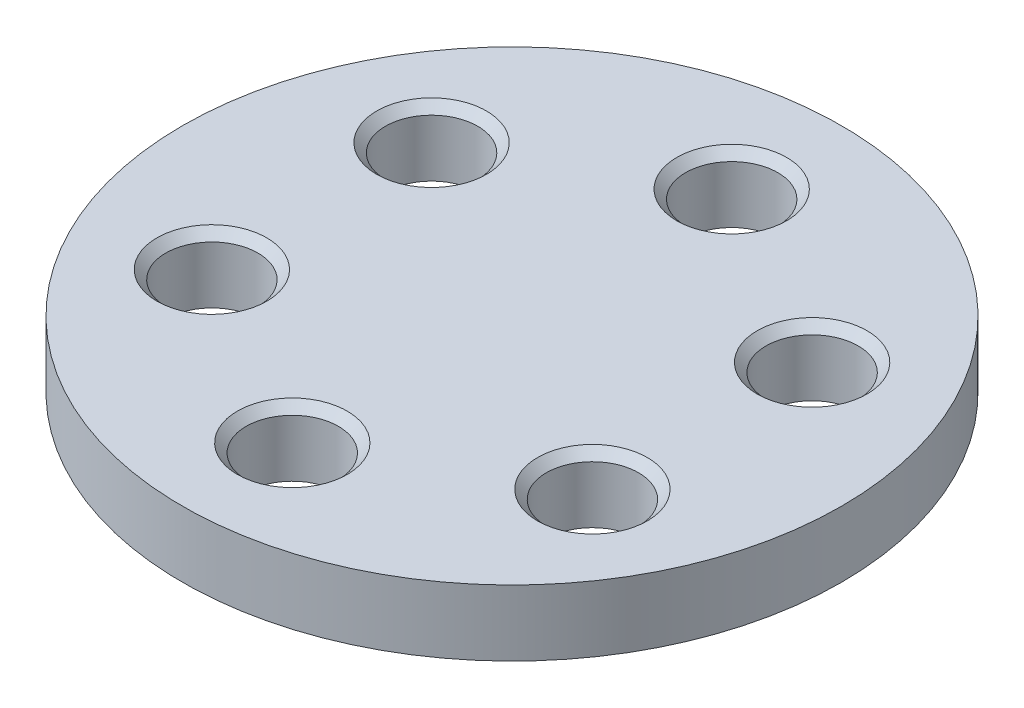
ISO-10303-21;
HEADER;
FILE_DESCRIPTION(('STEP AP214'),'2;1');
FILE_NAME('part.step','',(''),(''),'','','');
FILE_SCHEMA(('AUTOMOTIVE_DESIGN { 1 0 10303 214 1 1 1 1 }'));
ENDSEC;
DATA;
#1=APPLICATION_CONTEXT('core data for automotive mechanical design processes');
#2=APPLICATION_PROTOCOL_DEFINITION('international standard','automotive_design',2000,#1);
#3=PRODUCT_CONTEXT('',#1,'mechanical');
#4=PRODUCT('Part','Part','',(#3));
#5=PRODUCT_RELATED_PRODUCT_CATEGORY('part','',(#4));
#6=PRODUCT_DEFINITION_FORMATION('','',#4);
#7=PRODUCT_DEFINITION_CONTEXT('part definition',#1,'design');
#8=PRODUCT_DEFINITION('design','',#6,#7);
#9=PRODUCT_DEFINITION_SHAPE('','',#8);
#10=(LENGTH_UNIT() NAMED_UNIT(*) SI_UNIT(.MILLI.,.METRE.));
#11=(NAMED_UNIT(*) PLANE_ANGLE_UNIT() SI_UNIT($,.RADIAN.));
#12=(NAMED_UNIT(*) SI_UNIT($,.STERADIAN.) SOLID_ANGLE_UNIT());
#13=UNCERTAINTY_MEASURE_WITH_UNIT(LENGTH_MEASURE(1.E-05),#10,'distance_accuracy_value','');
#14=(GEOMETRIC_REPRESENTATION_CONTEXT(3) GLOBAL_UNCERTAINTY_ASSIGNED_CONTEXT((#13)) GLOBAL_UNIT_ASSIGNED_CONTEXT((#10,
#11,#12)) REPRESENTATION_CONTEXT('',''));
#15=CARTESIAN_POINT('',(0.,0.,0.));
#16=DIRECTION('',(0.,0.,1.));
#17=DIRECTION('',(1.,0.,0.));
#18=AXIS2_PLACEMENT_3D('',#15,#16,#17);
#19=CARTESIAN_POINT('',(-1.26546179408335E-13,43.9999999999999,0.));
#20=DIRECTION('',(0.,1.,0.));
#21=DIRECTION('',(-0.998143310073028,0.,-0.0609092156940087));
#22=AXIS2_PLACEMENT_3D('',#19,#20,#21);
#23=PLANE('',#22);
#24=CARTESIAN_POINT('',(-1.46592133389029E-13,43.9999999999999,-10.));
#25=DIRECTION('',(0.,1.,0.));
#26=DIRECTION('',(0.,0.,1.));
#27=AXIS2_PLACEMENT_3D('',#24,#25,#26);
#28=CIRCLE('',#27,2.5);
#29=CARTESIAN_POINT('',(-1.46592133389029E-13,43.9999999999999,-7.5));
#30=VERTEX_POINT('',#29);
#31=EDGE_CURVE('E101',#30,#30,#28,.T.);
#32=ORIENTED_EDGE('',*,*,#31,.F.);
#33=EDGE_LOOP('',(#32));
#34=FACE_BOUND('',#33,.T.);
#35=CARTESIAN_POINT('',(8.66025403784424,44.,-5.));
#36=DIRECTION('',(0.,1.,0.));
#37=DIRECTION('',(0.,0.,1.));
#38=AXIS2_PLACEMENT_3D('',#35,#36,#37);
#39=CIRCLE('',#38,2.5);
#40=CARTESIAN_POINT('',(8.66025403784424,44.,-2.5));
#41=VERTEX_POINT('',#40);
#42=EDGE_CURVE('E92',#41,#41,#39,.T.);
#43=ORIENTED_EDGE('',*,*,#42,.F.);
#44=EDGE_LOOP('',(#43));
#45=FACE_BOUND('',#44,.T.);
#46=CARTESIAN_POINT('',(8.66025403784424,44.,5.));
#47=DIRECTION('',(0.,1.,0.));
#48=DIRECTION('',(0.,0.,1.));
#49=AXIS2_PLACEMENT_3D('',#46,#47,#48);
#50=CIRCLE('',#49,2.5);
#51=CARTESIAN_POINT('',(8.66025403784424,44.,7.5));
#52=VERTEX_POINT('',#51);
#53=EDGE_CURVE('E83',#52,#52,#50,.T.);
#54=ORIENTED_EDGE('',*,*,#53,.F.);
#55=EDGE_LOOP('',(#54));
#56=FACE_BOUND('',#55,.T.);
#57=CARTESIAN_POINT('',(-1.44437402907189E-13,43.9999999999999,10.));
#58=DIRECTION('',(0.,1.,0.));
#59=DIRECTION('',(0.,0.,1.));
#60=AXIS2_PLACEMENT_3D('',#57,#58,#59);
#61=CIRCLE('',#60,2.5);
#62=CARTESIAN_POINT('',(-1.44437402907189E-13,43.9999999999999,12.5));
#63=VERTEX_POINT('',#62);
#64=EDGE_CURVE('E74',#63,#63,#61,.T.);
#65=ORIENTED_EDGE('',*,*,#64,.F.);
#66=EDGE_LOOP('',(#65));
#67=FACE_BOUND('',#66,.T.);
#68=CARTESIAN_POINT('',(-8.66025403784453,43.9999999999999,5.00000000000001));
#69=DIRECTION('',(0.,1.,0.));
#70=DIRECTION('',(0.,0.,1.));
#71=AXIS2_PLACEMENT_3D('',#68,#69,#70);
#72=CIRCLE('',#71,2.5);
#73=CARTESIAN_POINT('',(-8.66025403784453,43.9999999999999,7.50000000000001));
#74=VERTEX_POINT('',#73);
#75=EDGE_CURVE('E65',#74,#74,#72,.T.);
#76=ORIENTED_EDGE('',*,*,#75,.F.);
#77=EDGE_LOOP('',(#76));
#78=FACE_BOUND('',#77,.T.);
#79=CARTESIAN_POINT('',(-8.66025403784453,43.9999999999999,-5.));
#80=DIRECTION('',(0.,1.,0.));
#81=DIRECTION('',(0.,0.,1.));
#82=AXIS2_PLACEMENT_3D('',#79,#80,#81);
#83=CIRCLE('',#82,2.5);
#84=CARTESIAN_POINT('',(-8.66025403784453,43.9999999999999,-2.5));
#85=VERTEX_POINT('',#84);
#86=EDGE_CURVE('E56',#85,#85,#83,.T.);
#87=ORIENTED_EDGE('',*,*,#86,.F.);
#88=EDGE_LOOP('',(#87));
#89=FACE_BOUND('',#88,.T.);
#90=CARTESIAN_POINT('',(-1.46887962200071E-13,43.9999999999999,0.));
#91=DIRECTION('',(0.,1.,0.));
#92=DIRECTION('',(-1.,0.,0.));
#93=AXIS2_PLACEMENT_3D('',#90,#91,#92);
#94=CIRCLE('',#93,15.);
#95=CARTESIAN_POINT('',(-15.0000000000001,43.9999999999999,0.));
#96=VERTEX_POINT('',#95);
#97=EDGE_CURVE('E10',#96,#96,#94,.F.);
#98=ORIENTED_EDGE('',*,*,#97,.F.);
#99=EDGE_LOOP('',(#98));
#100=FACE_BOUND('',#99,.T.);
#101=ADVANCED_FACE('F37',(#34,#45,#56,#67,#78,#89,#100),#23,.T.);
#102=CARTESIAN_POINT('',(-1.36597215203414E-13,40.9999999999999,0.));
#103=DIRECTION('',(0.,-1.,0.));
#104=DIRECTION('',(1.,0.,0.));
#105=AXIS2_PLACEMENT_3D('',#102,#103,#104);
#106=PLANE('',#105);
#107=CARTESIAN_POINT('',(-1.46592133389029E-13,40.9999999999999,-10.));
#108=DIRECTION('',(0.,1.,0.));
#109=DIRECTION('',(0.,0.,1.));
#110=AXIS2_PLACEMENT_3D('',#107,#108,#109);
#111=CIRCLE('',#110,2.1);
#112=CARTESIAN_POINT('',(-1.46592133389029E-13,40.9999999999999,-7.9));
#113=VERTEX_POINT('',#112);
#114=EDGE_CURVE('E95',#113,#113,#111,.T.);
#115=ORIENTED_EDGE('',*,*,#114,.T.);
#116=EDGE_LOOP('',(#115));
#117=FACE_BOUND('',#116,.T.);
#118=CARTESIAN_POINT('',(8.66025403784424,41.,-5.));
#119=DIRECTION('',(0.,1.,0.));
#120=DIRECTION('',(0.,0.,1.));
#121=AXIS2_PLACEMENT_3D('',#118,#119,#120);
#122=CIRCLE('',#121,2.1);
#123=CARTESIAN_POINT('',(8.66025403784424,41.,-2.9));
#124=VERTEX_POINT('',#123);
#125=EDGE_CURVE('E86',#124,#124,#122,.T.);
#126=ORIENTED_EDGE('',*,*,#125,.T.);
#127=EDGE_LOOP('',(#126));
#128=FACE_BOUND('',#127,.T.);
#129=CARTESIAN_POINT('',(8.66025403784424,41.,5.));
#130=DIRECTION('',(0.,1.,0.));
#131=DIRECTION('',(0.,0.,1.));
#132=AXIS2_PLACEMENT_3D('',#129,#130,#131);
#133=CIRCLE('',#132,2.1);
#134=CARTESIAN_POINT('',(8.66025403784424,41.,7.1));
#135=VERTEX_POINT('',#134);
#136=EDGE_CURVE('E77',#135,#135,#133,.T.);
#137=ORIENTED_EDGE('',*,*,#136,.T.);
#138=EDGE_LOOP('',(#137));
#139=FACE_BOUND('',#138,.T.);
#140=CARTESIAN_POINT('',(-1.44437402907189E-13,40.9999999999999,10.));
#141=DIRECTION('',(0.,1.,0.));
#142=DIRECTION('',(0.,0.,1.));
#143=AXIS2_PLACEMENT_3D('',#140,#141,#142);
#144=CIRCLE('',#143,2.1);
#145=CARTESIAN_POINT('',(-1.44437402907189E-13,40.9999999999999,12.1));
#146=VERTEX_POINT('',#145);
#147=EDGE_CURVE('E68',#146,#146,#144,.T.);
#148=ORIENTED_EDGE('',*,*,#147,.T.);
#149=EDGE_LOOP('',(#148));
#150=FACE_BOUND('',#149,.T.);
#151=CARTESIAN_POINT('',(-8.66025403784453,40.9999999999999,5.00000000000001));
#152=DIRECTION('',(0.,1.,0.));
#153=DIRECTION('',(0.,0.,1.));
#154=AXIS2_PLACEMENT_3D('',#151,#152,#153);
#155=CIRCLE('',#154,2.1);
#156=CARTESIAN_POINT('',(-8.66025403784453,40.9999999999999,7.1));
#157=VERTEX_POINT('',#156);
#158=EDGE_CURVE('E59',#157,#157,#155,.T.);
#159=ORIENTED_EDGE('',*,*,#158,.T.);
#160=EDGE_LOOP('',(#159));
#161=FACE_BOUND('',#160,.T.);
#162=CARTESIAN_POINT('',(-8.66025403784453,40.9999999999999,-5.));
#163=DIRECTION('',(0.,1.,0.));
#164=DIRECTION('',(0.,0.,1.));
#165=AXIS2_PLACEMENT_3D('',#162,#163,#164);
#166=CIRCLE('',#165,2.1);
#167=CARTESIAN_POINT('',(-8.66025403784453,40.9999999999999,-2.9));
#168=VERTEX_POINT('',#167);
#169=EDGE_CURVE('E47',#168,#168,#166,.T.);
#170=ORIENTED_EDGE('',*,*,#169,.T.);
#171=EDGE_LOOP('',(#170));
#172=FACE_BOUND('',#171,.T.);
#173=CARTESIAN_POINT('',(-1.36597215203414E-13,40.9999999999999,0.));
#174=DIRECTION('',(0.,-1.,0.));
#175=DIRECTION('',(1.,0.,0.));
#176=AXIS2_PLACEMENT_3D('',#173,#174,#175);
#177=CIRCLE('',#176,15.);
#178=CARTESIAN_POINT('',(14.9999999999999,41.,0.));
#179=VERTEX_POINT('',#178);
#180=EDGE_CURVE('E43',#179,#179,#177,.T.);
#181=ORIENTED_EDGE('',*,*,#180,.T.);
#182=EDGE_LOOP('',(#181));
#183=FACE_BOUND('',#182,.T.);
#184=ADVANCED_FACE('F109',(#117,#128,#139,#150,#161,#172,#183),#106,.T.);
#185=CARTESIAN_POINT('',(-2.924211018963E-13,86.4264068711927,0.));
#186=DIRECTION('',(0.,-1.,0.));
#187=DIRECTION('',(1.,0.,0.));
#188=AXIS2_PLACEMENT_3D('',#185,#186,#187);
#189=CYLINDRICAL_SURFACE('',#188,15.);
#190=ORIENTED_EDGE('',*,*,#180,.F.);
#191=EDGE_LOOP('',(#190));
#192=FACE_BOUND('',#191,.T.);
#193=ORIENTED_EDGE('',*,*,#97,.T.);
#194=EDGE_LOOP('',(#193));
#195=FACE_BOUND('',#194,.T.);
#196=ADVANCED_FACE('F134',(#192,#195),#189,.T.);
#197=CARTESIAN_POINT('',(-8.66025403784453,43.9999999999999,-5.));
#198=DIRECTION('',(0.,1.,0.));
#199=DIRECTION('',(0.,0.,1.));
#200=AXIS2_PLACEMENT_3D('',#197,#198,#199);
#201=CYLINDRICAL_SURFACE('',#200,2.09999999999999);
#202=ORIENTED_EDGE('',*,*,#169,.F.);
#203=EDGE_LOOP('',(#202));
#204=FACE_BOUND('',#203,.T.);
#205=CARTESIAN_POINT('',(-8.66025403784453,43.5999999999999,-5.));
#206=DIRECTION('',(0.,1.,0.));
#207=DIRECTION('',(0.,0.,1.));
#208=AXIS2_PLACEMENT_3D('',#205,#206,#207);
#209=CIRCLE('',#208,2.09999999999999);
#210=CARTESIAN_POINT('',(-8.66025403784453,43.5999999999999,-2.90000000000001));
#211=VERTEX_POINT('',#210);
#212=EDGE_CURVE('E51',#211,#211,#209,.T.);
#213=ORIENTED_EDGE('',*,*,#212,.T.);
#214=EDGE_LOOP('',(#213));
#215=FACE_BOUND('',#214,.T.);
#216=ADVANCED_FACE('F124',(#204,#215),#201,.F.);
#217=CARTESIAN_POINT('',(-8.66025403784453,43.9999999999999,-5.));
#218=DIRECTION('',(0.,1.,0.));
#219=DIRECTION('',(0.,0.,1.));
#220=AXIS2_PLACEMENT_3D('',#217,#218,#219);
#221=CONICAL_SURFACE('',#220,2.5,0.78539816339745);
#222=ORIENTED_EDGE('',*,*,#212,.F.);
#223=EDGE_LOOP('',(#222));
#224=FACE_BOUND('',#223,.T.);
#225=ORIENTED_EDGE('',*,*,#86,.T.);
#226=EDGE_LOOP('',(#225));
#227=FACE_BOUND('',#226,.T.);
#228=ADVANCED_FACE('F121',(#224,#227),#221,.F.);
#229=CARTESIAN_POINT('',(-8.66025403784453,43.9999999999999,5.00000000000001));
#230=DIRECTION('',(0.,1.,0.));
#231=DIRECTION('',(0.,0.,1.));
#232=AXIS2_PLACEMENT_3D('',#229,#230,#231);
#233=CYLINDRICAL_SURFACE('',#232,2.09999999999999);
#234=ORIENTED_EDGE('',*,*,#158,.F.);
#235=EDGE_LOOP('',(#234));
#236=FACE_BOUND('',#235,.T.);
#237=CARTESIAN_POINT('',(-8.66025403784453,43.5999999999999,5.00000000000001));
#238=DIRECTION('',(0.,1.,0.));
#239=DIRECTION('',(0.,0.,1.));
#240=AXIS2_PLACEMENT_3D('',#237,#238,#239);
#241=CIRCLE('',#240,2.09999999999999);
#242=CARTESIAN_POINT('',(-8.66025403784453,43.5999999999999,7.09999999999999));
#243=VERTEX_POINT('',#242);
#244=EDGE_CURVE('E62',#243,#243,#241,.T.);
#245=ORIENTED_EDGE('',*,*,#244,.T.);
#246=EDGE_LOOP('',(#245));
#247=FACE_BOUND('',#246,.T.);
#248=ADVANCED_FACE('F123',(#236,#247),#233,.F.);
#249=CARTESIAN_POINT('',(-8.66025403784453,43.9999999999999,5.00000000000001));
#250=DIRECTION('',(0.,1.,0.));
#251=DIRECTION('',(0.,0.,1.));
#252=AXIS2_PLACEMENT_3D('',#249,#250,#251);
#253=CONICAL_SURFACE('',#252,2.5,0.78539816339745);
#254=ORIENTED_EDGE('',*,*,#244,.F.);
#255=EDGE_LOOP('',(#254));
#256=FACE_BOUND('',#255,.T.);
#257=ORIENTED_EDGE('',*,*,#75,.T.);
#258=EDGE_LOOP('',(#257));
#259=FACE_BOUND('',#258,.T.);
#260=ADVANCED_FACE('F131',(#256,#259),#253,.F.);
#261=CARTESIAN_POINT('',(-1.44437402907189E-13,43.9999999999999,10.));
#262=DIRECTION('',(0.,1.,0.));
#263=DIRECTION('',(0.,0.,1.));
#264=AXIS2_PLACEMENT_3D('',#261,#262,#263);
#265=CYLINDRICAL_SURFACE('',#264,2.09999999999999);
#266=ORIENTED_EDGE('',*,*,#147,.F.);
#267=EDGE_LOOP('',(#266));
#268=FACE_BOUND('',#267,.T.);
#269=CARTESIAN_POINT('',(-1.44437402907189E-13,43.5999999999999,10.));
#270=DIRECTION('',(0.,1.,0.));
#271=DIRECTION('',(0.,0.,1.));
#272=AXIS2_PLACEMENT_3D('',#269,#270,#271);
#273=CIRCLE('',#272,2.09999999999999);
#274=CARTESIAN_POINT('',(-1.44437402907189E-13,43.5999999999999,12.1));
#275=VERTEX_POINT('',#274);
#276=EDGE_CURVE('E71',#275,#275,#273,.T.);
#277=ORIENTED_EDGE('',*,*,#276,.T.);
#278=EDGE_LOOP('',(#277));
#279=FACE_BOUND('',#278,.T.);
#280=ADVANCED_FACE('F177',(#268,#279),#265,.F.);
#281=CARTESIAN_POINT('',(-1.44437402907189E-13,43.9999999999999,10.));
#282=DIRECTION('',(0.,1.,0.));
#283=DIRECTION('',(0.,0.,1.));
#284=AXIS2_PLACEMENT_3D('',#281,#282,#283);
#285=CONICAL_SURFACE('',#284,2.5,0.78539816339745);
#286=ORIENTED_EDGE('',*,*,#276,.F.);
#287=EDGE_LOOP('',(#286));
#288=FACE_BOUND('',#287,.T.);
#289=ORIENTED_EDGE('',*,*,#64,.T.);
#290=EDGE_LOOP('',(#289));
#291=FACE_BOUND('',#290,.T.);
#292=ADVANCED_FACE('F187',(#288,#291),#285,.F.);
#293=CARTESIAN_POINT('',(8.66025403784424,44.,5.));
#294=DIRECTION('',(0.,1.,0.));
#295=DIRECTION('',(0.,0.,1.));
#296=AXIS2_PLACEMENT_3D('',#293,#294,#295);
#297=CYLINDRICAL_SURFACE('',#296,2.09999999999999);
#298=ORIENTED_EDGE('',*,*,#136,.F.);
#299=EDGE_LOOP('',(#298));
#300=FACE_BOUND('',#299,.T.);
#301=CARTESIAN_POINT('',(8.66025403784424,43.6,5.));
#302=DIRECTION('',(0.,1.,0.));
#303=DIRECTION('',(0.,0.,1.));
#304=AXIS2_PLACEMENT_3D('',#301,#302,#303);
#305=CIRCLE('',#304,2.09999999999999);
#306=CARTESIAN_POINT('',(8.66025403784424,43.6,7.09999999999999));
#307=VERTEX_POINT('',#306);
#308=EDGE_CURVE('E80',#307,#307,#305,.T.);
#309=ORIENTED_EDGE('',*,*,#308,.T.);
#310=EDGE_LOOP('',(#309));
#311=FACE_BOUND('',#310,.T.);
#312=ADVANCED_FACE('F198',(#300,#311),#297,.F.);
#313=CARTESIAN_POINT('',(8.66025403784424,44.,5.));
#314=DIRECTION('',(0.,1.,0.));
#315=DIRECTION('',(0.,0.,1.));
#316=AXIS2_PLACEMENT_3D('',#313,#314,#315);
#317=CONICAL_SURFACE('',#316,2.5,0.78539816339745);
#318=ORIENTED_EDGE('',*,*,#308,.F.);
#319=EDGE_LOOP('',(#318));
#320=FACE_BOUND('',#319,.T.);
#321=ORIENTED_EDGE('',*,*,#53,.T.);
#322=EDGE_LOOP('',(#321));
#323=FACE_BOUND('',#322,.T.);
#324=ADVANCED_FACE('F209',(#320,#323),#317,.F.);
#325=CARTESIAN_POINT('',(8.66025403784424,44.,-5.));
#326=DIRECTION('',(0.,1.,0.));
#327=DIRECTION('',(0.,0.,1.));
#328=AXIS2_PLACEMENT_3D('',#325,#326,#327);
#329=CYLINDRICAL_SURFACE('',#328,2.09999999999999);
#330=ORIENTED_EDGE('',*,*,#125,.F.);
#331=EDGE_LOOP('',(#330));
#332=FACE_BOUND('',#331,.T.);
#333=CARTESIAN_POINT('',(8.66025403784424,43.6,-5.));
#334=DIRECTION('',(0.,1.,0.));
#335=DIRECTION('',(0.,0.,1.));
#336=AXIS2_PLACEMENT_3D('',#333,#334,#335);
#337=CIRCLE('',#336,2.09999999999999);
#338=CARTESIAN_POINT('',(8.66025403784424,43.6,-2.90000000000001));
#339=VERTEX_POINT('',#338);
#340=EDGE_CURVE('E89',#339,#339,#337,.T.);
#341=ORIENTED_EDGE('',*,*,#340,.T.);
#342=EDGE_LOOP('',(#341));
#343=FACE_BOUND('',#342,.T.);
#344=ADVANCED_FACE('F220',(#332,#343),#329,.F.);
#345=CARTESIAN_POINT('',(8.66025403784424,44.,-5.));
#346=DIRECTION('',(0.,1.,0.));
#347=DIRECTION('',(0.,0.,1.));
#348=AXIS2_PLACEMENT_3D('',#345,#346,#347);
#349=CONICAL_SURFACE('',#348,2.5,0.78539816339745);
#350=ORIENTED_EDGE('',*,*,#340,.F.);
#351=EDGE_LOOP('',(#350));
#352=FACE_BOUND('',#351,.T.);
#353=ORIENTED_EDGE('',*,*,#42,.T.);
#354=EDGE_LOOP('',(#353));
#355=FACE_BOUND('',#354,.T.);
#356=ADVANCED_FACE('F231',(#352,#355),#349,.F.);
#357=CARTESIAN_POINT('',(-1.46592133389029E-13,43.9999999999999,-10.));
#358=DIRECTION('',(0.,1.,0.));
#359=DIRECTION('',(0.,0.,1.));
#360=AXIS2_PLACEMENT_3D('',#357,#358,#359);
#361=CYLINDRICAL_SURFACE('',#360,2.09999999999999);
#362=ORIENTED_EDGE('',*,*,#114,.F.);
#363=EDGE_LOOP('',(#362));
#364=FACE_BOUND('',#363,.T.);
#365=CARTESIAN_POINT('',(-1.46592133389029E-13,43.5999999999999,-10.));
#366=DIRECTION('',(0.,1.,0.));
#367=DIRECTION('',(0.,0.,1.));
#368=AXIS2_PLACEMENT_3D('',#365,#366,#367);
#369=CIRCLE('',#368,2.09999999999999);
#370=CARTESIAN_POINT('',(-1.46592133389029E-13,43.5999999999999,-7.90000000000001));
#371=VERTEX_POINT('',#370);
#372=EDGE_CURVE('E98',#371,#371,#369,.T.);
#373=ORIENTED_EDGE('',*,*,#372,.T.);
#374=EDGE_LOOP('',(#373));
#375=FACE_BOUND('',#374,.T.);
#376=ADVANCED_FACE('F242',(#364,#375),#361,.F.);
#377=CARTESIAN_POINT('',(-1.46592133389029E-13,43.9999999999999,-10.));
#378=DIRECTION('',(0.,1.,0.));
#379=DIRECTION('',(0.,0.,1.));
#380=AXIS2_PLACEMENT_3D('',#377,#378,#379);
#381=CONICAL_SURFACE('',#380,2.5,0.78539816339745);
#382=ORIENTED_EDGE('',*,*,#372,.F.);
#383=EDGE_LOOP('',(#382));
#384=FACE_BOUND('',#383,.T.);
#385=ORIENTED_EDGE('',*,*,#31,.T.);
#386=EDGE_LOOP('',(#385));
#387=FACE_BOUND('',#386,.T.);
#388=ADVANCED_FACE('F105',(#384,#387),#381,.F.);
#389=CLOSED_SHELL('',(#101,#184,#196,#216,#228,#248,#260,#280,#292,#312,#324,#344,#356,#376,#388));
#390=MANIFOLD_SOLID_BREP('B2',#389);
#391=ADVANCED_BREP_SHAPE_REPRESENTATION('',(#18,#390),#14);
#392=SHAPE_DEFINITION_REPRESENTATION(#9,#391);
ENDSEC;
END-ISO-10303-21;
